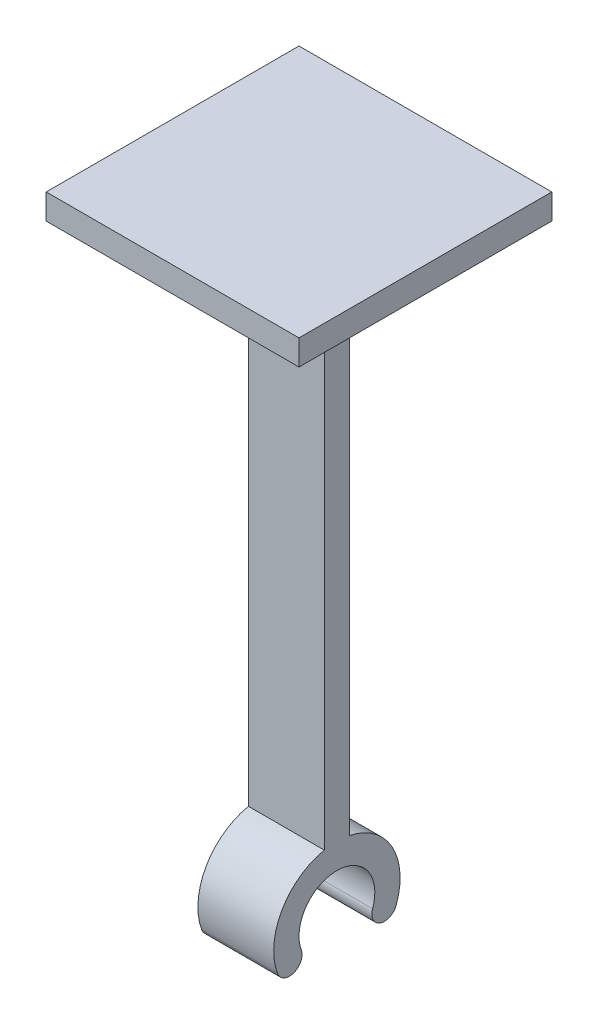
ISO-10303-21;
HEADER;
FILE_DESCRIPTION(('STEP AP214'),'2;1');
FILE_NAME('part.step','',(''),(''),'','','');
FILE_SCHEMA(('AUTOMOTIVE_DESIGN { 1 0 10303 214 1 1 1 1 }'));
ENDSEC;
DATA;
#1=APPLICATION_CONTEXT('core data for automotive mechanical design processes');
#2=APPLICATION_PROTOCOL_DEFINITION('international standard','automotive_design',2000,#1);
#3=PRODUCT_CONTEXT('',#1,'mechanical');
#4=PRODUCT('Part','Part','',(#3));
#5=PRODUCT_RELATED_PRODUCT_CATEGORY('part','',(#4));
#6=PRODUCT_DEFINITION_FORMATION('','',#4);
#7=PRODUCT_DEFINITION_CONTEXT('part definition',#1,'design');
#8=PRODUCT_DEFINITION('design','',#6,#7);
#9=PRODUCT_DEFINITION_SHAPE('','',#8);
#10=(LENGTH_UNIT() NAMED_UNIT(*) SI_UNIT(.MILLI.,.METRE.));
#11=(NAMED_UNIT(*) PLANE_ANGLE_UNIT() SI_UNIT($,.RADIAN.));
#12=(NAMED_UNIT(*) SI_UNIT($,.STERADIAN.) SOLID_ANGLE_UNIT());
#13=UNCERTAINTY_MEASURE_WITH_UNIT(LENGTH_MEASURE(1.E-05),#10,'distance_accuracy_value','');
#14=(GEOMETRIC_REPRESENTATION_CONTEXT(3) GLOBAL_UNCERTAINTY_ASSIGNED_CONTEXT((#13)) GLOBAL_UNIT_ASSIGNED_CONTEXT((#10,
#11,#12)) REPRESENTATION_CONTEXT('',''));
#15=CARTESIAN_POINT('',(0.,0.,0.));
#16=DIRECTION('',(0.,0.,1.));
#17=DIRECTION('',(1.,0.,0.));
#18=AXIS2_PLACEMENT_3D('',#15,#16,#17);
#19=CARTESIAN_POINT('',(3.,0.,0.));
#20=DIRECTION('',(-1.,0.,0.));
#21=DIRECTION('',(0.,0.,1.));
#22=AXIS2_PLACEMENT_3D('',#19,#20,#21);
#23=CYLINDRICAL_SURFACE('',#22,5.);
#24=CARTESIAN_POINT('',(-3.,0.,0.));
#25=DIRECTION('',(1.,0.,0.));
#26=DIRECTION('',(0.,0.,-1.));
#27=AXIS2_PLACEMENT_3D('',#24,#25,#26);
#28=CIRCLE('',#27,5.);
#29=CARTESIAN_POINT('',(-3.,-1.71010071662835,-4.69846310392954));
#30=VERTEX_POINT('',#29);
#31=CARTESIAN_POINT('',(-3.,4.89897948556635,-1.00000000000001));
#32=VERTEX_POINT('',#31);
#33=EDGE_CURVE('E208',#30,#32,#28,.T.);
#34=ORIENTED_EDGE('',*,*,#33,.T.);
#35=DIRECTION('',(-1.,0.,0.));
#36=VECTOR('',#35,1.);
#37=CARTESIAN_POINT('',(3.,4.89897948556636,-1.));
#38=LINE('',#37,#36);
#39=CARTESIAN_POINT('',(3.,4.89897948556636,-1.));
#40=VERTEX_POINT('',#39);
#41=EDGE_CURVE('E67',#40,#32,#38,.T.);
#42=ORIENTED_EDGE('',*,*,#41,.F.);
#43=CARTESIAN_POINT('',(3.,0.,0.));
#44=DIRECTION('',(1.,0.,0.));
#45=DIRECTION('',(0.,0.,-1.));
#46=AXIS2_PLACEMENT_3D('',#43,#44,#45);
#47=CIRCLE('',#46,5.);
#48=CARTESIAN_POINT('',(3.,-1.71010071662835,-4.69846310392954));
#49=VERTEX_POINT('',#48);
#50=EDGE_CURVE('E223',#49,#40,#47,.T.);
#51=ORIENTED_EDGE('',*,*,#50,.F.);
#52=DIRECTION('',(-1.,0.,0.));
#53=VECTOR('',#52,1.);
#54=CARTESIAN_POINT('',(3.,-1.71010071662835,-4.69846310392954));
#55=LINE('',#54,#53);
#56=EDGE_CURVE('E52',#49,#30,#55,.T.);
#57=ORIENTED_EDGE('',*,*,#56,.T.);
#58=EDGE_LOOP('',(#34,#42,#51,#57));
#59=FACE_BOUND('',#58,.T.);
#60=ADVANCED_FACE('F43',(#59),#23,.T.);
#61=DIRECTION('',(-1.,0.,0.));
#62=VECTOR('',#61,1.);
#63=CARTESIAN_POINT('',(3.,4.89897948556636,1.));
#64=LINE('',#63,#62);
#65=CARTESIAN_POINT('',(3.,4.89897948556636,1.));
#66=VERTEX_POINT('',#65);
#67=CARTESIAN_POINT('',(-3.,4.89897948556636,0.999999999999995));
#68=VERTEX_POINT('',#67);
#69=EDGE_CURVE('E59',#66,#68,#64,.T.);
#70=ORIENTED_EDGE('',*,*,#69,.T.);
#71=CARTESIAN_POINT('',(-3.,-1.71010071662835,4.69846310392954));
#72=VERTEX_POINT('',#71);
#73=EDGE_CURVE('E207',#68,#72,#28,.T.);
#74=ORIENTED_EDGE('',*,*,#73,.T.);
#75=DIRECTION('',(-1.,0.,0.));
#76=VECTOR('',#75,1.);
#77=CARTESIAN_POINT('',(3.,-1.71010071662835,4.69846310392954));
#78=LINE('',#77,#76);
#79=CARTESIAN_POINT('',(3.,-1.71010071662835,4.69846310392954));
#80=VERTEX_POINT('',#79);
#81=EDGE_CURVE('E235',#80,#72,#78,.T.);
#82=ORIENTED_EDGE('',*,*,#81,.F.);
#83=EDGE_CURVE('E222',#66,#80,#47,.T.);
#84=ORIENTED_EDGE('',*,*,#83,.F.);
#85=EDGE_LOOP('',(#70,#74,#82,#84));
#86=FACE_BOUND('',#85,.T.);
#87=ADVANCED_FACE('F268',(#86),#23,.T.);
#88=CARTESIAN_POINT('',(3.,0.,0.));
#89=DIRECTION('',(-1.,0.,0.));
#90=DIRECTION('',(0.,0.,1.));
#91=AXIS2_PLACEMENT_3D('',#88,#89,#90);
#92=CYLINDRICAL_SURFACE('',#91,3.);
#93=DIRECTION('',(-1.,0.,0.));
#94=VECTOR('',#93,1.);
#95=CARTESIAN_POINT('',(3.,-1.02606042997701,2.81907786235773));
#96=LINE('',#95,#94);
#97=CARTESIAN_POINT('',(3.,-1.02606042997701,2.81907786235773));
#98=VERTEX_POINT('',#97);
#99=CARTESIAN_POINT('',(-3.,-1.02606042997701,2.81907786235773));
#100=VERTEX_POINT('',#99);
#101=EDGE_CURVE('E231',#98,#100,#96,.T.);
#102=ORIENTED_EDGE('',*,*,#101,.T.);
#103=CARTESIAN_POINT('',(-3.,0.,0.));
#104=DIRECTION('',(1.,0.,0.));
#105=DIRECTION('',(0.,0.,-1.));
#106=AXIS2_PLACEMENT_3D('',#103,#104,#105);
#107=CIRCLE('',#106,3.);
#108=CARTESIAN_POINT('',(-3.,-1.02606042997701,-2.81907786235773));
#109=VERTEX_POINT('',#108);
#110=EDGE_CURVE('E200',#109,#100,#107,.T.);
#111=ORIENTED_EDGE('',*,*,#110,.F.);
#112=DIRECTION('',(-1.,0.,0.));
#113=VECTOR('',#112,1.);
#114=CARTESIAN_POINT('',(3.,-1.02606042997701,-2.81907786235773));
#115=LINE('',#114,#113);
#116=CARTESIAN_POINT('',(3.,-1.02606042997701,-2.81907786235773));
#117=VERTEX_POINT('',#116);
#118=EDGE_CURVE('E11',#117,#109,#115,.T.);
#119=ORIENTED_EDGE('',*,*,#118,.F.);
#120=CARTESIAN_POINT('',(3.,0.,0.));
#121=DIRECTION('',(1.,0.,0.));
#122=DIRECTION('',(0.,0.,-1.));
#123=AXIS2_PLACEMENT_3D('',#120,#121,#122);
#124=CIRCLE('',#123,3.);
#125=EDGE_CURVE('E215',#117,#98,#124,.T.);
#126=ORIENTED_EDGE('',*,*,#125,.T.);
#127=EDGE_LOOP('',(#102,#111,#119,#126));
#128=FACE_BOUND('',#127,.T.);
#129=ADVANCED_FACE('F45',(#128),#92,.F.);
#130=CARTESIAN_POINT('',(3.,-1.36808057330268,-3.75877048314363));
#131=DIRECTION('',(-1.,0.,0.));
#132=DIRECTION('',(0.,0.,1.));
#133=AXIS2_PLACEMENT_3D('',#130,#131,#132);
#134=CYLINDRICAL_SURFACE('',#133,1.);
#135=ORIENTED_EDGE('',*,*,#118,.T.);
#136=CARTESIAN_POINT('',(-3.,-1.36808057330268,-3.75877048314363));
#137=DIRECTION('',(1.,0.,0.));
#138=DIRECTION('',(0.,0.,-1.));
#139=AXIS2_PLACEMENT_3D('',#136,#137,#138);
#140=CIRCLE('',#139,1.);
#141=EDGE_CURVE('E203',#30,#109,#140,.F.);
#142=ORIENTED_EDGE('',*,*,#141,.F.);
#143=ORIENTED_EDGE('',*,*,#56,.F.);
#144=CARTESIAN_POINT('',(3.,-1.36808057330268,-3.75877048314363));
#145=DIRECTION('',(1.,0.,0.));
#146=DIRECTION('',(0.,0.,-1.));
#147=AXIS2_PLACEMENT_3D('',#144,#145,#146);
#148=CIRCLE('',#147,1.);
#149=EDGE_CURVE('E218',#49,#117,#148,.F.);
#150=ORIENTED_EDGE('',*,*,#149,.T.);
#151=EDGE_LOOP('',(#135,#142,#143,#150));
#152=FACE_BOUND('',#151,.T.);
#153=ADVANCED_FACE('F245',(#152),#134,.T.);
#154=CARTESIAN_POINT('',(3.,-1.36808057330268,3.75877048314363));
#155=DIRECTION('',(-1.,0.,0.));
#156=DIRECTION('',(0.,0.,1.));
#157=AXIS2_PLACEMENT_3D('',#154,#155,#156);
#158=CYLINDRICAL_SURFACE('',#157,1.);
#159=ORIENTED_EDGE('',*,*,#81,.T.);
#160=CARTESIAN_POINT('',(-3.,-1.36808057330268,3.75877048314363));
#161=DIRECTION('',(1.,0.,0.));
#162=DIRECTION('',(0.,0.,-1.));
#163=AXIS2_PLACEMENT_3D('',#160,#161,#162);
#164=CIRCLE('',#163,1.);
#165=EDGE_CURVE('E211',#72,#100,#164,.T.);
#166=ORIENTED_EDGE('',*,*,#165,.T.);
#167=ORIENTED_EDGE('',*,*,#101,.F.);
#168=CARTESIAN_POINT('',(3.,-1.36808057330268,3.75877048314363));
#169=DIRECTION('',(1.,0.,0.));
#170=DIRECTION('',(0.,0.,-1.));
#171=AXIS2_PLACEMENT_3D('',#168,#169,#170);
#172=CIRCLE('',#171,1.);
#173=EDGE_CURVE('E227',#80,#98,#172,.T.);
#174=ORIENTED_EDGE('',*,*,#173,.F.);
#175=EDGE_LOOP('',(#159,#166,#167,#174));
#176=FACE_BOUND('',#175,.T.);
#177=ADVANCED_FACE('F266',(#176),#158,.T.);
#178=CARTESIAN_POINT('',(3.,0.,0.));
#179=DIRECTION('',(1.,0.,0.));
#180=DIRECTION('',(0.,0.,-1.));
#181=AXIS2_PLACEMENT_3D('',#178,#179,#180);
#182=PLANE('',#181);
#183=ORIENTED_EDGE('',*,*,#173,.T.);
#184=ORIENTED_EDGE('',*,*,#125,.F.);
#185=ORIENTED_EDGE('',*,*,#149,.F.);
#186=ORIENTED_EDGE('',*,*,#50,.T.);
#187=DIRECTION('',(0.,1.,0.));
#188=VECTOR('',#187,1.);
#189=CARTESIAN_POINT('',(3.,0.,-1.));
#190=LINE('',#189,#188);
#191=CARTESIAN_POINT('',(3.,46.,-1.));
#192=VERTEX_POINT('',#191);
#193=EDGE_CURVE('E178',#40,#192,#190,.T.);
#194=ORIENTED_EDGE('',*,*,#193,.T.);
#195=DIRECTION('',(0.,0.,-1.));
#196=VECTOR('',#195,1.);
#197=CARTESIAN_POINT('',(3.,46.,1.59594559789866E-13));
#198=LINE('',#197,#196);
#199=CARTESIAN_POINT('',(3.,46.,1.));
#200=VERTEX_POINT('',#199);
#201=EDGE_CURVE('E182',#200,#192,#198,.T.);
#202=ORIENTED_EDGE('',*,*,#201,.F.);
#203=DIRECTION('',(0.,1.,0.));
#204=VECTOR('',#203,1.);
#205=CARTESIAN_POINT('',(3.,0.,1.));
#206=LINE('',#205,#204);
#207=EDGE_CURVE('E186',#66,#200,#206,.T.);
#208=ORIENTED_EDGE('',*,*,#207,.F.);
#209=ORIENTED_EDGE('',*,*,#83,.T.);
#210=EDGE_LOOP('',(#183,#184,#185,#186,#194,#202,#208,#209));
#211=FACE_BOUND('',#210,.T.);
#212=ADVANCED_FACE('F259',(#211),#182,.T.);
#213=CARTESIAN_POINT('',(-3.,0.,0.));
#214=DIRECTION('',(1.,0.,0.));
#215=DIRECTION('',(0.,0.,-1.));
#216=AXIS2_PLACEMENT_3D('',#213,#214,#215);
#217=PLANE('',#216);
#218=ORIENTED_EDGE('',*,*,#110,.T.);
#219=ORIENTED_EDGE('',*,*,#165,.F.);
#220=ORIENTED_EDGE('',*,*,#73,.F.);
#221=DIRECTION('',(0.,-1.,0.));
#222=VECTOR('',#221,1.);
#223=CARTESIAN_POINT('',(-3.,0.,0.999999999999994));
#224=LINE('',#223,#222);
#225=CARTESIAN_POINT('',(-3.,46.,1.));
#226=VERTEX_POINT('',#225);
#227=EDGE_CURVE('E174',#226,#68,#224,.T.);
#228=ORIENTED_EDGE('',*,*,#227,.F.);
#229=DIRECTION('',(0.,0.,-1.));
#230=VECTOR('',#229,1.);
#231=CARTESIAN_POINT('',(-3.,46.,0.));
#232=LINE('',#231,#230);
#233=CARTESIAN_POINT('',(-3.,46.,-1.));
#234=VERTEX_POINT('',#233);
#235=EDGE_CURVE('E166',#226,#234,#232,.T.);
#236=ORIENTED_EDGE('',*,*,#235,.T.);
#237=DIRECTION('',(0.,-1.,0.));
#238=VECTOR('',#237,1.);
#239=CARTESIAN_POINT('',(-3.,0.,-1.00000000000001));
#240=LINE('',#239,#238);
#241=EDGE_CURVE('E161',#234,#32,#240,.T.);
#242=ORIENTED_EDGE('',*,*,#241,.T.);
#243=ORIENTED_EDGE('',*,*,#33,.F.);
#244=ORIENTED_EDGE('',*,*,#141,.T.);
#245=EDGE_LOOP('',(#218,#219,#220,#228,#236,#242,#243,#244));
#246=FACE_BOUND('',#245,.T.);
#247=ADVANCED_FACE('F248',(#246),#217,.F.);
#248=CARTESIAN_POINT('',(3.,0.,-1.));
#249=DIRECTION('',(0.,0.,1.));
#250=DIRECTION('',(1.,0.,0.));
#251=AXIS2_PLACEMENT_3D('',#248,#249,#250);
#252=PLANE('',#251);
#253=ORIENTED_EDGE('',*,*,#193,.F.);
#254=ORIENTED_EDGE('',*,*,#41,.T.);
#255=ORIENTED_EDGE('',*,*,#241,.F.);
#256=DIRECTION('',(-1.,0.,0.));
#257=VECTOR('',#256,1.);
#258=CARTESIAN_POINT('',(3.,46.,-1.));
#259=LINE('',#258,#257);
#260=EDGE_CURVE('E192',#192,#234,#259,.T.);
#261=ORIENTED_EDGE('',*,*,#260,.F.);
#262=EDGE_LOOP('',(#253,#254,#255,#261));
#263=FACE_BOUND('',#262,.T.);
#264=ADVANCED_FACE('F251',(#263),#252,.F.);
#265=CARTESIAN_POINT('',(3.,0.,1.));
#266=DIRECTION('',(0.,0.,1.));
#267=DIRECTION('',(1.,0.,0.));
#268=AXIS2_PLACEMENT_3D('',#265,#266,#267);
#269=PLANE('',#268);
#270=ORIENTED_EDGE('',*,*,#69,.F.);
#271=ORIENTED_EDGE('',*,*,#207,.T.);
#272=DIRECTION('',(-1.,0.,0.));
#273=VECTOR('',#272,1.);
#274=CARTESIAN_POINT('',(3.,46.,1.));
#275=LINE('',#274,#273);
#276=EDGE_CURVE('E189',#200,#226,#275,.T.);
#277=ORIENTED_EDGE('',*,*,#276,.T.);
#278=ORIENTED_EDGE('',*,*,#227,.T.);
#279=EDGE_LOOP('',(#270,#271,#277,#278));
#280=FACE_BOUND('',#279,.T.);
#281=ADVANCED_FACE('F272',(#280),#269,.T.);
#282=CARTESIAN_POINT('',(10.,48.,10.0000000000002));
#283=DIRECTION('',(-1.,0.,0.));
#284=DIRECTION('',(0.,0.,1.));
#285=AXIS2_PLACEMENT_3D('',#282,#283,#284);
#286=PLANE('',#285);
#287=DIRECTION('',(0.,0.,-1.));
#288=VECTOR('',#287,1.);
#289=CARTESIAN_POINT('',(10.,46.,10.0000000000002));
#290=LINE('',#289,#288);
#291=CARTESIAN_POINT('',(10.,46.,10.0000000000002));
#292=VERTEX_POINT('',#291);
#293=CARTESIAN_POINT('',(10.,46.,-9.99999999999984));
#294=VERTEX_POINT('',#293);
#295=EDGE_CURVE('E159',#292,#294,#290,.T.);
#296=ORIENTED_EDGE('',*,*,#295,.T.);
#297=DIRECTION('',(0.,-1.,0.));
#298=VECTOR('',#297,1.);
#299=CARTESIAN_POINT('',(10.,48.,-9.99999999999984));
#300=LINE('',#299,#298);
#301=CARTESIAN_POINT('',(10.,48.,-9.99999999999984));
#302=VERTEX_POINT('',#301);
#303=EDGE_CURVE('E137',#302,#294,#300,.T.);
#304=ORIENTED_EDGE('',*,*,#303,.F.);
#305=DIRECTION('',(0.,0.,-1.));
#306=VECTOR('',#305,1.);
#307=CARTESIAN_POINT('',(10.,48.,10.0000000000002));
#308=LINE('',#307,#306);
#309=CARTESIAN_POINT('',(10.,48.,10.0000000000002));
#310=VERTEX_POINT('',#309);
#311=EDGE_CURVE('E145',#310,#302,#308,.T.);
#312=ORIENTED_EDGE('',*,*,#311,.F.);
#313=DIRECTION('',(0.,-1.,0.));
#314=VECTOR('',#313,1.);
#315=CARTESIAN_POINT('',(10.,48.,10.0000000000002));
#316=LINE('',#315,#314);
#317=EDGE_CURVE('E396',#310,#292,#316,.T.);
#318=ORIENTED_EDGE('',*,*,#317,.T.);
#319=EDGE_LOOP('',(#296,#304,#312,#318));
#320=FACE_BOUND('',#319,.T.);
#321=ADVANCED_FACE('F157',(#320),#286,.F.);
#322=CARTESIAN_POINT('',(-10.,48.,-9.99999999999984));
#323=DIRECTION('',(0.,0.,1.));
#324=DIRECTION('',(1.,0.,0.));
#325=AXIS2_PLACEMENT_3D('',#322,#323,#324);
#326=PLANE('',#325);
#327=DIRECTION('',(-1.,0.,0.));
#328=VECTOR('',#327,1.);
#329=CARTESIAN_POINT('',(-10.,46.,-9.99999999999984));
#330=LINE('',#329,#328);
#331=CARTESIAN_POINT('',(-10.,46.,-9.99999999999984));
#332=VERTEX_POINT('',#331);
#333=EDGE_CURVE('E404',#294,#332,#330,.T.);
#334=ORIENTED_EDGE('',*,*,#333,.T.);
#335=DIRECTION('',(0.,-1.,0.));
#336=VECTOR('',#335,1.);
#337=CARTESIAN_POINT('',(-10.,48.,-9.99999999999984));
#338=LINE('',#337,#336);
#339=CARTESIAN_POINT('',(-10.,48.,-9.99999999999984));
#340=VERTEX_POINT('',#339);
#341=EDGE_CURVE('E140',#340,#332,#338,.T.);
#342=ORIENTED_EDGE('',*,*,#341,.F.);
#343=DIRECTION('',(-1.,0.,0.));
#344=VECTOR('',#343,1.);
#345=CARTESIAN_POINT('',(-10.,48.,-9.99999999999984));
#346=LINE('',#345,#344);
#347=EDGE_CURVE('E133',#302,#340,#346,.T.);
#348=ORIENTED_EDGE('',*,*,#347,.F.);
#349=ORIENTED_EDGE('',*,*,#303,.T.);
#350=EDGE_LOOP('',(#334,#342,#348,#349));
#351=FACE_BOUND('',#350,.T.);
#352=ADVANCED_FACE('F135',(#351),#326,.F.);
#353=CARTESIAN_POINT('',(-10.,48.,10.0000000000002));
#354=DIRECTION('',(1.,0.,0.));
#355=DIRECTION('',(0.,0.,-1.));
#356=AXIS2_PLACEMENT_3D('',#353,#354,#355);
#357=PLANE('',#356);
#358=DIRECTION('',(0.,0.,1.));
#359=VECTOR('',#358,1.);
#360=CARTESIAN_POINT('',(-10.,46.,10.0000000000002));
#361=LINE('',#360,#359);
#362=CARTESIAN_POINT('',(-10.,46.,10.0000000000002));
#363=VERTEX_POINT('',#362);
#364=EDGE_CURVE('E400',#332,#363,#361,.T.);
#365=ORIENTED_EDGE('',*,*,#364,.T.);
#366=DIRECTION('',(0.,-1.,0.));
#367=VECTOR('',#366,1.);
#368=CARTESIAN_POINT('',(-10.,48.,10.0000000000002));
#369=LINE('',#368,#367);
#370=CARTESIAN_POINT('',(-10.,48.,10.0000000000002));
#371=VERTEX_POINT('',#370);
#372=EDGE_CURVE('E168',#371,#363,#369,.T.);
#373=ORIENTED_EDGE('',*,*,#372,.F.);
#374=DIRECTION('',(0.,0.,1.));
#375=VECTOR('',#374,1.);
#376=CARTESIAN_POINT('',(-10.,48.,10.0000000000002));
#377=LINE('',#376,#375);
#378=EDGE_CURVE('E144',#340,#371,#377,.T.);
#379=ORIENTED_EDGE('',*,*,#378,.F.);
#380=ORIENTED_EDGE('',*,*,#341,.T.);
#381=EDGE_LOOP('',(#365,#373,#379,#380));
#382=FACE_BOUND('',#381,.T.);
#383=ADVANCED_FACE('F355',(#382),#357,.F.);
#384=CARTESIAN_POINT('',(-10.,48.,10.0000000000002));
#385=DIRECTION('',(0.,0.,-1.));
#386=DIRECTION('',(-1.,0.,0.));
#387=AXIS2_PLACEMENT_3D('',#384,#385,#386);
#388=PLANE('',#387);
#389=DIRECTION('',(1.,0.,0.));
#390=VECTOR('',#389,1.);
#391=CARTESIAN_POINT('',(-10.,46.,10.0000000000002));
#392=LINE('',#391,#390);
#393=EDGE_CURVE('E155',#363,#292,#392,.T.);
#394=ORIENTED_EDGE('',*,*,#393,.T.);
#395=ORIENTED_EDGE('',*,*,#317,.F.);
#396=DIRECTION('',(1.,0.,0.));
#397=VECTOR('',#396,1.);
#398=CARTESIAN_POINT('',(-10.,48.,10.0000000000002));
#399=LINE('',#398,#397);
#400=EDGE_CURVE('E150',#371,#310,#399,.T.);
#401=ORIENTED_EDGE('',*,*,#400,.F.);
#402=ORIENTED_EDGE('',*,*,#372,.T.);
#403=EDGE_LOOP('',(#394,#395,#401,#402));
#404=FACE_BOUND('',#403,.T.);
#405=ADVANCED_FACE('F364',(#404),#388,.F.);
#406=CARTESIAN_POINT('',(0.,48.,0.));
#407=DIRECTION('',(0.,-1.,0.));
#408=DIRECTION('',(0.,0.,-1.));
#409=AXIS2_PLACEMENT_3D('',#406,#407,#408);
#410=PLANE('',#409);
#411=ORIENTED_EDGE('',*,*,#311,.T.);
#412=ORIENTED_EDGE('',*,*,#347,.T.);
#413=ORIENTED_EDGE('',*,*,#378,.T.);
#414=ORIENTED_EDGE('',*,*,#400,.T.);
#415=EDGE_LOOP('',(#411,#412,#413,#414));
#416=FACE_BOUND('',#415,.T.);
#417=ADVANCED_FACE('F148',(#416),#410,.F.);
#418=CARTESIAN_POINT('',(0.,46.,0.));
#419=DIRECTION('',(0.,-1.,0.));
#420=DIRECTION('',(0.,0.,-1.));
#421=AXIS2_PLACEMENT_3D('',#418,#419,#420);
#422=PLANE('',#421);
#423=ORIENTED_EDGE('',*,*,#201,.T.);
#424=ORIENTED_EDGE('',*,*,#260,.T.);
#425=ORIENTED_EDGE('',*,*,#235,.F.);
#426=ORIENTED_EDGE('',*,*,#276,.F.);
#427=EDGE_LOOP('',(#423,#424,#425,#426));
#428=FACE_BOUND('',#427,.T.);
#429=ORIENTED_EDGE('',*,*,#295,.F.);
#430=ORIENTED_EDGE('',*,*,#393,.F.);
#431=ORIENTED_EDGE('',*,*,#364,.F.);
#432=ORIENTED_EDGE('',*,*,#333,.F.);
#433=EDGE_LOOP('',(#429,#430,#431,#432));
#434=FACE_BOUND('',#433,.T.);
#435=ADVANCED_FACE('F253',(#428,#434),#422,.T.);
#436=CLOSED_SHELL('',(#60,#87,#129,#153,#177,#212,#247,#264,#281,#321,#352,#383,#405,#417,#435));
#437=MANIFOLD_SOLID_BREP('B2',#436);
#438=ADVANCED_BREP_SHAPE_REPRESENTATION('',(#18,#437),#14);
#439=SHAPE_DEFINITION_REPRESENTATION(#9,#438);
ENDSEC;
END-ISO-10303-21;
